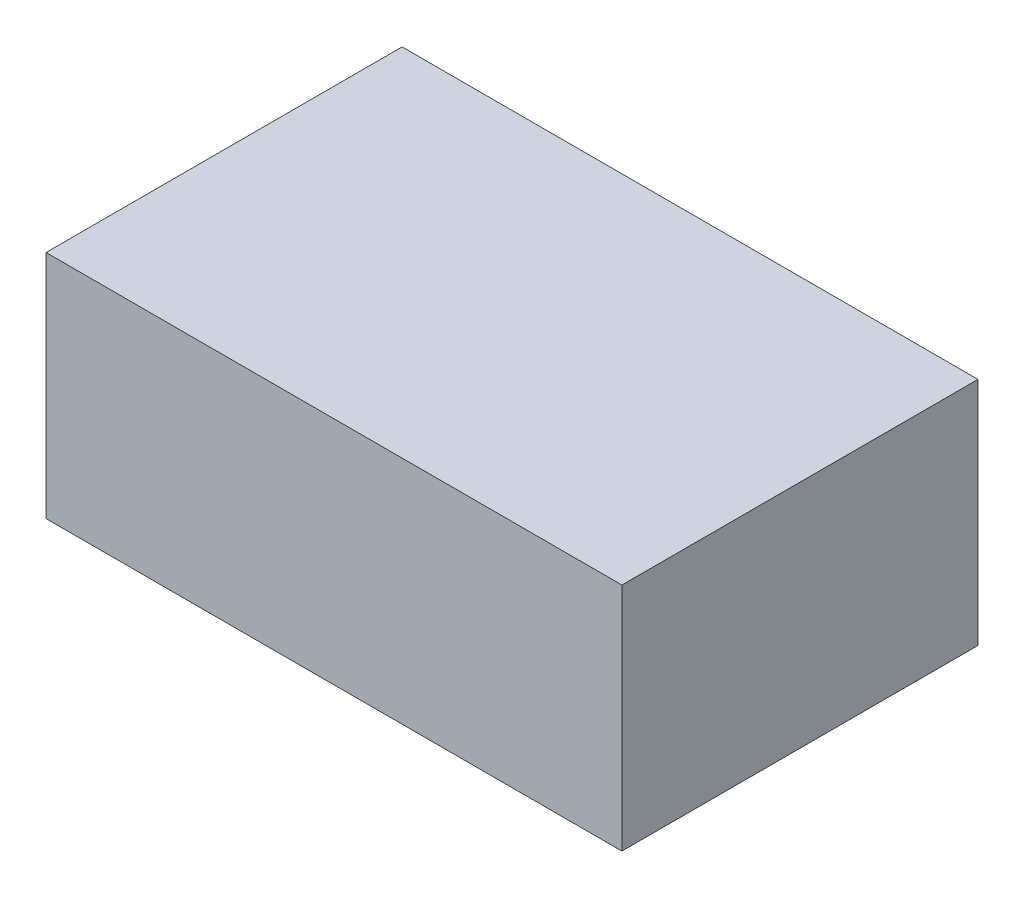
ISO-10303-21;
HEADER;
FILE_DESCRIPTION(('STEP AP214'),'2;1');
FILE_NAME('part.step','',(''),(''),'','','');
FILE_SCHEMA(('AUTOMOTIVE_DESIGN { 1 0 10303 214 1 1 1 1 }'));
ENDSEC;
DATA;
#1=APPLICATION_CONTEXT('core data for automotive mechanical design processes');
#2=APPLICATION_PROTOCOL_DEFINITION('international standard','automotive_design',2000,#1);
#3=PRODUCT_CONTEXT('',#1,'mechanical');
#4=PRODUCT('Part','Part','',(#3));
#5=PRODUCT_RELATED_PRODUCT_CATEGORY('part','',(#4));
#6=PRODUCT_DEFINITION_FORMATION('','',#4);
#7=PRODUCT_DEFINITION_CONTEXT('part definition',#1,'design');
#8=PRODUCT_DEFINITION('design','',#6,#7);
#9=PRODUCT_DEFINITION_SHAPE('','',#8);
#10=(LENGTH_UNIT() NAMED_UNIT(*) SI_UNIT(.MILLI.,.METRE.));
#11=(NAMED_UNIT(*) PLANE_ANGLE_UNIT() SI_UNIT($,.RADIAN.));
#12=(NAMED_UNIT(*) SI_UNIT($,.STERADIAN.) SOLID_ANGLE_UNIT());
#13=UNCERTAINTY_MEASURE_WITH_UNIT(LENGTH_MEASURE(1.E-05),#10,'distance_accuracy_value','');
#14=(GEOMETRIC_REPRESENTATION_CONTEXT(3) GLOBAL_UNCERTAINTY_ASSIGNED_CONTEXT((#13)) GLOBAL_UNIT_ASSIGNED_CONTEXT((#10,
#11,#12)) REPRESENTATION_CONTEXT('',''));
#15=CARTESIAN_POINT('',(0.,0.,0.));
#16=DIRECTION('',(0.,0.,1.));
#17=DIRECTION('',(1.,0.,0.));
#18=AXIS2_PLACEMENT_3D('',#15,#16,#17);
#19=CARTESIAN_POINT('',(0.,63.5,-98.1221280754162));
#20=DIRECTION('',(1.,0.,0.));
#21=DIRECTION('',(0.,0.,-1.));
#22=AXIS2_PLACEMENT_3D('',#19,#20,#21);
#23=PLANE('',#22);
#24=DIRECTION('',(0.,0.,1.));
#25=VECTOR('',#24,1.);
#26=CARTESIAN_POINT('',(0.,0.,-98.1221280754162));
#27=LINE('',#26,#25);
#28=CARTESIAN_POINT('',(0.,0.,-98.1221280754162));
#29=VERTEX_POINT('',#28);
#30=CARTESIAN_POINT('',(0.,0.,0.));
#31=VERTEX_POINT('',#30);
#32=EDGE_CURVE('E102',#29,#31,#27,.T.);
#33=ORIENTED_EDGE('',*,*,#32,.T.);
#34=DIRECTION('',(0.,-1.,0.));
#35=VECTOR('',#34,1.);
#36=CARTESIAN_POINT('',(0.,63.5,0.));
#37=LINE('',#36,#35);
#38=CARTESIAN_POINT('',(0.,63.5,0.));
#39=VERTEX_POINT('',#38);
#40=EDGE_CURVE('E11',#39,#31,#37,.T.);
#41=ORIENTED_EDGE('',*,*,#40,.F.);
#42=DIRECTION('',(0.,0.,1.));
#43=VECTOR('',#42,1.);
#44=CARTESIAN_POINT('',(0.,63.5,-98.1221280754162));
#45=LINE('',#44,#43);
#46=CARTESIAN_POINT('',(0.,63.5,-98.1221280754162));
#47=VERTEX_POINT('',#46);
#48=EDGE_CURVE('E90',#47,#39,#45,.T.);
#49=ORIENTED_EDGE('',*,*,#48,.F.);
#50=DIRECTION('',(0.,-1.,0.));
#51=VECTOR('',#50,1.);
#52=CARTESIAN_POINT('',(0.,63.5,-98.1221280754162));
#53=LINE('',#52,#51);
#54=EDGE_CURVE('E98',#47,#29,#53,.T.);
#55=ORIENTED_EDGE('',*,*,#54,.T.);
#56=EDGE_LOOP('',(#33,#41,#49,#55));
#57=FACE_BOUND('',#56,.T.);
#58=ADVANCED_FACE('F39',(#57),#23,.F.);
#59=CARTESIAN_POINT('',(0.,63.5,0.));
#60=DIRECTION('',(0.,0.,-1.));
#61=DIRECTION('',(-1.,0.,0.));
#62=AXIS2_PLACEMENT_3D('',#59,#60,#61);
#63=PLANE('',#62);
#64=DIRECTION('',(1.,0.,0.));
#65=VECTOR('',#64,1.);
#66=CARTESIAN_POINT('',(0.,0.,0.));
#67=LINE('',#66,#65);
#68=CARTESIAN_POINT('',(158.685463524729,0.,0.));
#69=VERTEX_POINT('',#68);
#70=EDGE_CURVE('E94',#31,#69,#67,.T.);
#71=ORIENTED_EDGE('',*,*,#70,.T.);
#72=DIRECTION('',(0.,-1.,0.));
#73=VECTOR('',#72,1.);
#74=CARTESIAN_POINT('',(158.685463524729,63.5,0.));
#75=LINE('',#74,#73);
#76=CARTESIAN_POINT('',(158.685463524729,63.5,0.));
#77=VERTEX_POINT('',#76);
#78=EDGE_CURVE('E47',#77,#69,#75,.T.);
#79=ORIENTED_EDGE('',*,*,#78,.F.);
#80=DIRECTION('',(1.,0.,0.));
#81=VECTOR('',#80,1.);
#82=CARTESIAN_POINT('',(0.,63.5,0.));
#83=LINE('',#82,#81);
#84=EDGE_CURVE('E85',#39,#77,#83,.T.);
#85=ORIENTED_EDGE('',*,*,#84,.F.);
#86=ORIENTED_EDGE('',*,*,#40,.T.);
#87=EDGE_LOOP('',(#71,#79,#85,#86));
#88=FACE_BOUND('',#87,.T.);
#89=ADVANCED_FACE('F93',(#88),#63,.F.);
#90=CARTESIAN_POINT('',(158.685463524729,63.5,-98.1221280754162));
#91=DIRECTION('',(-1.,0.,0.));
#92=DIRECTION('',(0.,0.,1.));
#93=AXIS2_PLACEMENT_3D('',#90,#91,#92);
#94=PLANE('',#93);
#95=DIRECTION('',(0.,0.,-1.));
#96=VECTOR('',#95,1.);
#97=CARTESIAN_POINT('',(158.685463524729,0.,-98.1221280754162));
#98=LINE('',#97,#96);
#99=CARTESIAN_POINT('',(158.685463524729,0.,-98.1221280754162));
#100=VERTEX_POINT('',#99);
#101=EDGE_CURVE('E72',#69,#100,#98,.T.);
#102=ORIENTED_EDGE('',*,*,#101,.T.);
#103=DIRECTION('',(0.,-1.,0.));
#104=VECTOR('',#103,1.);
#105=CARTESIAN_POINT('',(158.685463524729,63.5,-98.1221280754162));
#106=LINE('',#105,#104);
#107=CARTESIAN_POINT('',(158.685463524729,63.5,-98.1221280754162));
#108=VERTEX_POINT('',#107);
#109=EDGE_CURVE('E95',#108,#100,#106,.T.);
#110=ORIENTED_EDGE('',*,*,#109,.F.);
#111=DIRECTION('',(0.,0.,-1.));
#112=VECTOR('',#111,1.);
#113=CARTESIAN_POINT('',(158.685463524729,63.5,-98.1221280754162));
#114=LINE('',#113,#112);
#115=EDGE_CURVE('E88',#77,#108,#114,.T.);
#116=ORIENTED_EDGE('',*,*,#115,.F.);
#117=ORIENTED_EDGE('',*,*,#78,.T.);
#118=EDGE_LOOP('',(#102,#110,#116,#117));
#119=FACE_BOUND('',#118,.T.);
#120=ADVANCED_FACE('F96',(#119),#94,.F.);
#121=CARTESIAN_POINT('',(0.,63.5,-98.1221280754162));
#122=DIRECTION('',(0.,0.,1.));
#123=DIRECTION('',(1.,0.,0.));
#124=AXIS2_PLACEMENT_3D('',#121,#122,#123);
#125=PLANE('',#124);
#126=DIRECTION('',(-1.,0.,0.));
#127=VECTOR('',#126,1.);
#128=CARTESIAN_POINT('',(0.,0.,-98.1221280754162));
#129=LINE('',#128,#127);
#130=EDGE_CURVE('E78',#100,#29,#129,.T.);
#131=ORIENTED_EDGE('',*,*,#130,.T.);
#132=ORIENTED_EDGE('',*,*,#54,.F.);
#133=DIRECTION('',(-1.,0.,0.));
#134=VECTOR('',#133,1.);
#135=CARTESIAN_POINT('',(0.,63.5,-98.1221280754162));
#136=LINE('',#135,#134);
#137=EDGE_CURVE('E55',#108,#47,#136,.T.);
#138=ORIENTED_EDGE('',*,*,#137,.F.);
#139=ORIENTED_EDGE('',*,*,#109,.T.);
#140=EDGE_LOOP('',(#131,#132,#138,#139));
#141=FACE_BOUND('',#140,.T.);
#142=ADVANCED_FACE('F109',(#141),#125,.F.);
#143=CARTESIAN_POINT('',(0.,63.5,0.));
#144=DIRECTION('',(0.,1.,0.));
#145=DIRECTION('',(0.,0.,1.));
#146=AXIS2_PLACEMENT_3D('',#143,#144,#145);
#147=PLANE('',#146);
#148=ORIENTED_EDGE('',*,*,#48,.T.);
#149=ORIENTED_EDGE('',*,*,#84,.T.);
#150=ORIENTED_EDGE('',*,*,#115,.T.);
#151=ORIENTED_EDGE('',*,*,#137,.T.);
#152=EDGE_LOOP('',(#148,#149,#150,#151));
#153=FACE_BOUND('',#152,.T.);
#154=ADVANCED_FACE('F86',(#153),#147,.T.);
#155=CARTESIAN_POINT('',(0.,0.,0.));
#156=DIRECTION('',(0.,1.,0.));
#157=DIRECTION('',(0.,0.,1.));
#158=AXIS2_PLACEMENT_3D('',#155,#156,#157);
#159=PLANE('',#158);
#160=ORIENTED_EDGE('',*,*,#32,.F.);
#161=ORIENTED_EDGE('',*,*,#130,.F.);
#162=ORIENTED_EDGE('',*,*,#101,.F.);
#163=ORIENTED_EDGE('',*,*,#70,.F.);
#164=EDGE_LOOP('',(#160,#161,#162,#163));
#165=FACE_BOUND('',#164,.T.);
#166=ADVANCED_FACE('F112',(#165),#159,.F.);
#167=CLOSED_SHELL('',(#58,#89,#120,#142,#154,#166));
#168=MANIFOLD_SOLID_BREP('B2',#167);
#169=ADVANCED_BREP_SHAPE_REPRESENTATION('',(#18,#168),#14);
#170=SHAPE_DEFINITION_REPRESENTATION(#9,#169);
ENDSEC;
END-ISO-10303-21;
